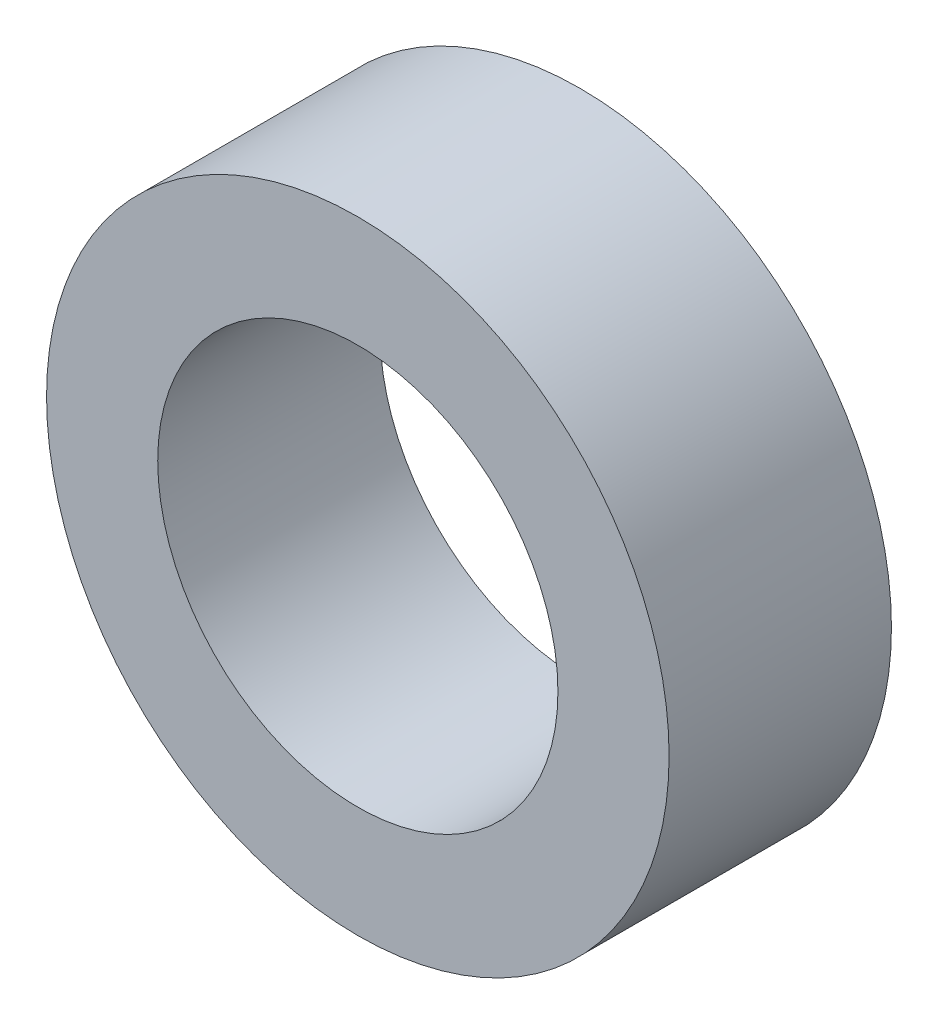
ISO-10303-21;
HEADER;
FILE_DESCRIPTION(('STEP AP214'),'2;1');
FILE_NAME('part.step','',(''),(''),'','','');
FILE_SCHEMA(('AUTOMOTIVE_DESIGN { 1 0 10303 214 1 1 1 1 }'));
ENDSEC;
DATA;
#1=APPLICATION_CONTEXT('core data for automotive mechanical design processes');
#2=APPLICATION_PROTOCOL_DEFINITION('international standard','automotive_design',2000,#1);
#3=PRODUCT_CONTEXT('',#1,'mechanical');
#4=PRODUCT('Part','Part','',(#3));
#5=PRODUCT_RELATED_PRODUCT_CATEGORY('part','',(#4));
#6=PRODUCT_DEFINITION_FORMATION('','',#4);
#7=PRODUCT_DEFINITION_CONTEXT('part definition',#1,'design');
#8=PRODUCT_DEFINITION('design','',#6,#7);
#9=PRODUCT_DEFINITION_SHAPE('','',#8);
#10=(LENGTH_UNIT() NAMED_UNIT(*) SI_UNIT(.MILLI.,.METRE.));
#11=(NAMED_UNIT(*) PLANE_ANGLE_UNIT() SI_UNIT($,.RADIAN.));
#12=(NAMED_UNIT(*) SI_UNIT($,.STERADIAN.) SOLID_ANGLE_UNIT());
#13=UNCERTAINTY_MEASURE_WITH_UNIT(LENGTH_MEASURE(1.E-05),#10,'distance_accuracy_value','');
#14=(GEOMETRIC_REPRESENTATION_CONTEXT(3) GLOBAL_UNCERTAINTY_ASSIGNED_CONTEXT((#13)) GLOBAL_UNIT_ASSIGNED_CONTEXT((#10,
#11,#12)) REPRESENTATION_CONTEXT('',''));
#15=CARTESIAN_POINT('',(0.,0.,0.));
#16=DIRECTION('',(0.,0.,1.));
#17=DIRECTION('',(1.,0.,0.));
#18=AXIS2_PLACEMENT_3D('',#15,#16,#17);
#19=CARTESIAN_POINT('',(0.,0.,2.5));
#20=DIRECTION('',(0.,0.,1.));
#21=DIRECTION('',(1.,0.,0.));
#22=AXIS2_PLACEMENT_3D('',#19,#20,#21);
#23=PLANE('',#22);
#24=CARTESIAN_POINT('',(0.,0.,2.5));
#25=DIRECTION('',(0.,0.,1.));
#26=DIRECTION('',(1.,0.,0.));
#27=AXIS2_PLACEMENT_3D('',#24,#25,#26);
#28=CIRCLE('',#27,3.5);
#29=CARTESIAN_POINT('',(3.5,0.,2.5));
#30=VERTEX_POINT('',#29);
#31=EDGE_CURVE('E10',#30,#30,#28,.T.);
#32=ORIENTED_EDGE('',*,*,#31,.T.);
#33=EDGE_LOOP('',(#32));
#34=FACE_BOUND('',#33,.T.);
#35=CARTESIAN_POINT('',(0.,0.,2.5));
#36=DIRECTION('',(0.,0.,1.));
#37=DIRECTION('',(1.,0.,0.));
#38=AXIS2_PLACEMENT_3D('',#35,#36,#37);
#39=CIRCLE('',#38,2.25);
#40=CARTESIAN_POINT('',(2.25,0.,2.5));
#41=VERTEX_POINT('',#40);
#42=EDGE_CURVE('E50',#41,#41,#39,.T.);
#43=ORIENTED_EDGE('',*,*,#42,.F.);
#44=EDGE_LOOP('',(#43));
#45=FACE_BOUND('',#44,.T.);
#46=ADVANCED_FACE('F39',(#34,#45),#23,.T.);
#47=CARTESIAN_POINT('',(0.,0.,0.));
#48=DIRECTION('',(0.,0.,1.));
#49=DIRECTION('',(1.,0.,0.));
#50=AXIS2_PLACEMENT_3D('',#47,#48,#49);
#51=PLANE('',#50);
#52=CARTESIAN_POINT('',(0.,0.,0.));
#53=DIRECTION('',(0.,0.,1.));
#54=DIRECTION('',(1.,0.,0.));
#55=AXIS2_PLACEMENT_3D('',#52,#53,#54);
#56=CIRCLE('',#55,3.5);
#57=CARTESIAN_POINT('',(3.5,0.,0.));
#58=VERTEX_POINT('',#57);
#59=EDGE_CURVE('E43',#58,#58,#56,.T.);
#60=ORIENTED_EDGE('',*,*,#59,.F.);
#61=EDGE_LOOP('',(#60));
#62=FACE_BOUND('',#61,.T.);
#63=CARTESIAN_POINT('',(0.,0.,0.));
#64=DIRECTION('',(0.,0.,1.));
#65=DIRECTION('',(1.,0.,0.));
#66=AXIS2_PLACEMENT_3D('',#63,#64,#65);
#67=CIRCLE('',#66,2.25);
#68=CARTESIAN_POINT('',(2.25,0.,0.));
#69=VERTEX_POINT('',#68);
#70=EDGE_CURVE('E52',#69,#69,#67,.T.);
#71=ORIENTED_EDGE('',*,*,#70,.T.);
#72=EDGE_LOOP('',(#71));
#73=FACE_BOUND('',#72,.T.);
#74=ADVANCED_FACE('F62',(#62,#73),#51,.F.);
#75=CARTESIAN_POINT('',(0.,0.,2.5));
#76=DIRECTION('',(0.,0.,-1.));
#77=DIRECTION('',(-1.,0.,0.));
#78=AXIS2_PLACEMENT_3D('',#75,#76,#77);
#79=CYLINDRICAL_SURFACE('',#78,3.5);
#80=ORIENTED_EDGE('',*,*,#31,.F.);
#81=EDGE_LOOP('',(#80));
#82=FACE_BOUND('',#81,.T.);
#83=ORIENTED_EDGE('',*,*,#59,.T.);
#84=EDGE_LOOP('',(#83));
#85=FACE_BOUND('',#84,.T.);
#86=ADVANCED_FACE('F41',(#82,#85),#79,.T.);
#87=CARTESIAN_POINT('',(0.,0.,2.5));
#88=DIRECTION('',(0.,0.,-1.));
#89=DIRECTION('',(-1.,0.,0.));
#90=AXIS2_PLACEMENT_3D('',#87,#88,#89);
#91=CYLINDRICAL_SURFACE('',#90,2.25);
#92=ORIENTED_EDGE('',*,*,#42,.T.);
#93=EDGE_LOOP('',(#92));
#94=FACE_BOUND('',#93,.T.);
#95=ORIENTED_EDGE('',*,*,#70,.F.);
#96=EDGE_LOOP('',(#95));
#97=FACE_BOUND('',#96,.T.);
#98=ADVANCED_FACE('F58',(#94,#97),#91,.F.);
#99=CLOSED_SHELL('',(#46,#74,#86,#98));
#100=MANIFOLD_SOLID_BREP('B2',#99);
#101=ADVANCED_BREP_SHAPE_REPRESENTATION('',(#18,#100),#14);
#102=SHAPE_DEFINITION_REPRESENTATION(#9,#101);
ENDSEC;
END-ISO-10303-21;
